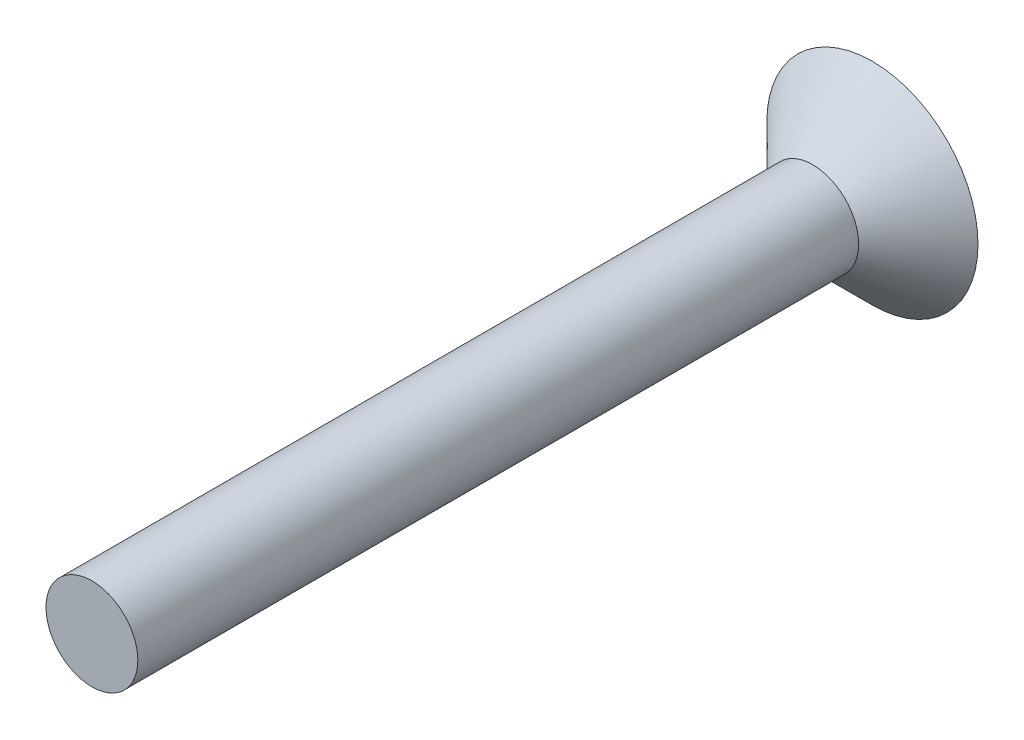
ISO-10303-21;
HEADER;
FILE_DESCRIPTION(('STEP AP214'),'2;1');
FILE_NAME('part.step','',(''),(''),'','','');
FILE_SCHEMA(('AUTOMOTIVE_DESIGN { 1 0 10303 214 1 1 1 1 }'));
ENDSEC;
DATA;
#1=APPLICATION_CONTEXT('core data for automotive mechanical design processes');
#2=APPLICATION_PROTOCOL_DEFINITION('international standard','automotive_design',2000,#1);
#3=PRODUCT_CONTEXT('',#1,'mechanical');
#4=PRODUCT('Part','Part','',(#3));
#5=PRODUCT_RELATED_PRODUCT_CATEGORY('part','',(#4));
#6=PRODUCT_DEFINITION_FORMATION('','',#4);
#7=PRODUCT_DEFINITION_CONTEXT('part definition',#1,'design');
#8=PRODUCT_DEFINITION('design','',#6,#7);
#9=PRODUCT_DEFINITION_SHAPE('','',#8);
#10=(LENGTH_UNIT() NAMED_UNIT(*) SI_UNIT(.MILLI.,.METRE.));
#11=(NAMED_UNIT(*) PLANE_ANGLE_UNIT() SI_UNIT($,.RADIAN.));
#12=(NAMED_UNIT(*) SI_UNIT($,.STERADIAN.) SOLID_ANGLE_UNIT());
#13=UNCERTAINTY_MEASURE_WITH_UNIT(LENGTH_MEASURE(1.E-05),#10,'distance_accuracy_value','');
#14=(GEOMETRIC_REPRESENTATION_CONTEXT(3) GLOBAL_UNCERTAINTY_ASSIGNED_CONTEXT((#13)) GLOBAL_UNIT_ASSIGNED_CONTEXT((#10,
#11,#12)) REPRESENTATION_CONTEXT('',''));
#15=CARTESIAN_POINT('',(0.,0.,0.));
#16=DIRECTION('',(0.,0.,1.));
#17=DIRECTION('',(1.,0.,0.));
#18=AXIS2_PLACEMENT_3D('',#15,#16,#17);
#19=CARTESIAN_POINT('',(0.,0.,34.));
#20=DIRECTION('',(0.,0.,-1.));
#21=DIRECTION('',(-1.,0.,0.));
#22=AXIS2_PLACEMENT_3D('',#19,#20,#21);
#23=CYLINDRICAL_SURFACE('',#22,2.);
#24=CARTESIAN_POINT('',(0.,0.,34.));
#25=DIRECTION('',(0.,0.,1.));
#26=DIRECTION('',(1.,0.,0.));
#27=AXIS2_PLACEMENT_3D('',#24,#25,#26);
#28=CIRCLE('',#27,2.);
#29=CARTESIAN_POINT('',(2.,0.,34.));
#30=VERTEX_POINT('',#29);
#31=EDGE_CURVE('E46',#30,#30,#28,.T.);
#32=ORIENTED_EDGE('',*,*,#31,.F.);
#33=EDGE_LOOP('',(#32));
#34=FACE_BOUND('',#33,.T.);
#35=CARTESIAN_POINT('',(0.,0.,2.6));
#36=DIRECTION('',(0.,0.,-1.));
#37=DIRECTION('',(-1.,0.,0.));
#38=AXIS2_PLACEMENT_3D('',#35,#36,#37);
#39=CIRCLE('',#38,2.);
#40=CARTESIAN_POINT('',(-2.,0.,2.6));
#41=VERTEX_POINT('',#40);
#42=EDGE_CURVE('E11',#41,#41,#39,.T.);
#43=ORIENTED_EDGE('',*,*,#42,.F.);
#44=EDGE_LOOP('',(#43));
#45=FACE_BOUND('',#44,.T.);
#46=ADVANCED_FACE('F38',(#34,#45),#23,.T.);
#47=CARTESIAN_POINT('',(0.,0.,34.));
#48=DIRECTION('',(0.,0.,1.));
#49=DIRECTION('',(1.,0.,0.));
#50=AXIS2_PLACEMENT_3D('',#47,#48,#49);
#51=PLANE('',#50);
#52=ORIENTED_EDGE('',*,*,#31,.T.);
#53=EDGE_LOOP('',(#52));
#54=FACE_BOUND('',#53,.T.);
#55=ADVANCED_FACE('F168',(#54),#51,.T.);
#56=CARTESIAN_POINT('',(0.,0.,2.6));
#57=DIRECTION('',(0.,0.,-1.));
#58=DIRECTION('',(-1.,0.,0.));
#59=AXIS2_PLACEMENT_3D('',#56,#57,#58);
#60=CONICAL_SURFACE('',#59,2.,0.785398163397448);
#61=CARTESIAN_POINT('',(0.,0.,0.));
#62=DIRECTION('',(0.,0.,-1.));
#63=DIRECTION('',(-1.,0.,0.));
#64=AXIS2_PLACEMENT_3D('',#61,#62,#63);
#65=CIRCLE('',#64,4.6);
#66=CARTESIAN_POINT('',(-4.6,0.,0.));
#67=VERTEX_POINT('',#66);
#68=EDGE_CURVE('E152',#67,#67,#65,.T.);
#69=ORIENTED_EDGE('',*,*,#68,.F.);
#70=EDGE_LOOP('',(#69));
#71=FACE_BOUND('',#70,.T.);
#72=ORIENTED_EDGE('',*,*,#42,.T.);
#73=EDGE_LOOP('',(#72));
#74=FACE_BOUND('',#73,.T.);
#75=ADVANCED_FACE('F174',(#71,#74),#60,.T.);
#76=CARTESIAN_POINT('',(0.,0.,0.));
#77=DIRECTION('',(0.,0.,1.));
#78=DIRECTION('',(1.,0.,0.));
#79=AXIS2_PLACEMENT_3D('',#76,#77,#78);
#80=PLANE('',#79);
#81=DIRECTION('',(0.593026118257889,-0.805183223287706,0.));
#82=VECTOR('',#81,1.);
#83=CARTESIAN_POINT('',(0.597011270214796,1.36468954097132,0.));
#84=LINE('',#83,#82);
#85=CARTESIAN_POINT('',(0.597011270214796,1.36468954097132,0.));
#86=VERTEX_POINT('',#85);
#87=CARTESIAN_POINT('',(1.48036144586749,0.165317844134031,0.));
#88=VERTEX_POINT('',#87);
#89=EDGE_CURVE('E133',#86,#88,#84,.T.);
#90=ORIENTED_EDGE('',*,*,#89,.F.);
#91=DIRECTION('',(0.993822185197136,0.110984071875153,0.));
#92=VECTOR('',#91,1.);
#93=CARTESIAN_POINT('',(-0.883350175652691,1.19937169683729,0.));
#94=LINE('',#93,#92);
#95=CARTESIAN_POINT('',(-0.883350175652691,1.19937169683729,0.));
#96=VERTEX_POINT('',#95);
#97=EDGE_CURVE('E53',#96,#86,#94,.T.);
#98=ORIENTED_EDGE('',*,*,#97,.F.);
#99=DIRECTION('',(0.400796066939247,0.91616729516286,0.));
#100=VECTOR('',#99,1.);
#101=CARTESIAN_POINT('',(-1.48036144586749,-0.165317844134032,0.));
#102=LINE('',#101,#100);
#103=CARTESIAN_POINT('',(-1.48036144586749,-0.165317844134032,0.));
#104=VERTEX_POINT('',#103);
#105=EDGE_CURVE('E146',#104,#96,#102,.T.);
#106=ORIENTED_EDGE('',*,*,#105,.F.);
#107=DIRECTION('',(-0.593026118257889,0.805183223287706,0.));
#108=VECTOR('',#107,1.);
#109=CARTESIAN_POINT('',(-0.597011270214795,-1.36468954097132,0.));
#110=LINE('',#109,#108);
#111=CARTESIAN_POINT('',(-0.597011270214795,-1.36468954097132,0.));
#112=VERTEX_POINT('',#111);
#113=EDGE_CURVE('E143',#112,#104,#110,.T.);
#114=ORIENTED_EDGE('',*,*,#113,.F.);
#115=DIRECTION('',(-0.993822185197136,-0.110984071875153,0.));
#116=VECTOR('',#115,1.);
#117=CARTESIAN_POINT('',(0.883350175652692,-1.19937169683729,0.));
#118=LINE('',#117,#116);
#119=CARTESIAN_POINT('',(0.883350175652692,-1.19937169683729,0.));
#120=VERTEX_POINT('',#119);
#121=EDGE_CURVE('E101',#120,#112,#118,.T.);
#122=ORIENTED_EDGE('',*,*,#121,.F.);
#123=DIRECTION('',(-0.400796066939247,-0.91616729516286,0.));
#124=VECTOR('',#123,1.);
#125=CARTESIAN_POINT('',(1.48036144586749,0.165317844134031,0.));
#126=LINE('',#125,#124);
#127=EDGE_CURVE('E137',#88,#120,#126,.T.);
#128=ORIENTED_EDGE('',*,*,#127,.F.);
#129=EDGE_LOOP('',(#90,#98,#106,#114,#122,#128));
#130=FACE_BOUND('',#129,.T.);
#131=ORIENTED_EDGE('',*,*,#68,.T.);
#132=EDGE_LOOP('',(#131));
#133=FACE_BOUND('',#132,.T.);
#134=ADVANCED_FACE('F176',(#130,#133),#80,.F.);
#135=CARTESIAN_POINT('',(-0.883350175652691,1.19937169683729,1.8));
#136=DIRECTION('',(-0.110984071875153,0.993822185197136,0.));
#137=DIRECTION('',(-0.993822185197136,-0.110984071875153,0.));
#138=AXIS2_PLACEMENT_3D('',#135,#136,#137);
#139=PLANE('',#138);
#140=ORIENTED_EDGE('',*,*,#97,.T.);
#141=DIRECTION('',(0.,0.,-1.));
#142=VECTOR('',#141,1.);
#143=CARTESIAN_POINT('',(0.597011270214796,1.36468954097132,1.8));
#144=LINE('',#143,#142);
#145=CARTESIAN_POINT('',(0.597011270214796,1.36468954097132,1.8));
#146=VERTEX_POINT('',#145);
#147=EDGE_CURVE('E83',#146,#86,#144,.T.);
#148=ORIENTED_EDGE('',*,*,#147,.F.);
#149=DIRECTION('',(0.993822185197136,0.110984071875153,0.));
#150=VECTOR('',#149,1.);
#151=CARTESIAN_POINT('',(-0.883350175652691,1.19937169683729,1.8));
#152=LINE('',#151,#150);
#153=CARTESIAN_POINT('',(-0.883350175652691,1.19937169683729,1.8));
#154=VERTEX_POINT('',#153);
#155=EDGE_CURVE('E149',#154,#146,#152,.T.);
#156=ORIENTED_EDGE('',*,*,#155,.F.);
#157=DIRECTION('',(0.,0.,-1.));
#158=VECTOR('',#157,1.);
#159=CARTESIAN_POINT('',(-0.883350175652691,1.19937169683729,1.8));
#160=LINE('',#159,#158);
#161=EDGE_CURVE('E61',#154,#96,#160,.T.);
#162=ORIENTED_EDGE('',*,*,#161,.T.);
#163=EDGE_LOOP('',(#140,#148,#156,#162));
#164=FACE_BOUND('',#163,.T.);
#165=ADVANCED_FACE('F184',(#164),#139,.F.);
#166=CARTESIAN_POINT('',(-1.48036144586749,-0.165317844134032,1.8));
#167=DIRECTION('',(-0.91616729516286,0.400796066939247,0.));
#168=DIRECTION('',(-0.400796066939247,-0.91616729516286,0.));
#169=AXIS2_PLACEMENT_3D('',#166,#167,#168);
#170=PLANE('',#169);
#171=ORIENTED_EDGE('',*,*,#105,.T.);
#172=ORIENTED_EDGE('',*,*,#161,.F.);
#173=DIRECTION('',(0.400796066939247,0.91616729516286,0.));
#174=VECTOR('',#173,1.);
#175=CARTESIAN_POINT('',(-1.48036144586749,-0.165317844134032,1.8));
#176=LINE('',#175,#174);
#177=CARTESIAN_POINT('',(-1.48036144586749,-0.165317844134032,1.8));
#178=VERTEX_POINT('',#177);
#179=EDGE_CURVE('E115',#178,#154,#176,.T.);
#180=ORIENTED_EDGE('',*,*,#179,.F.);
#181=DIRECTION('',(0.,0.,-1.));
#182=VECTOR('',#181,1.);
#183=CARTESIAN_POINT('',(-1.48036144586749,-0.165317844134032,1.8));
#184=LINE('',#183,#182);
#185=EDGE_CURVE('E106',#178,#104,#184,.T.);
#186=ORIENTED_EDGE('',*,*,#185,.T.);
#187=EDGE_LOOP('',(#171,#172,#180,#186));
#188=FACE_BOUND('',#187,.T.);
#189=ADVANCED_FACE('F191',(#188),#170,.F.);
#190=CARTESIAN_POINT('',(-0.597011270214795,-1.36468954097132,1.8));
#191=DIRECTION('',(-0.805183223287706,-0.593026118257889,0.));
#192=DIRECTION('',(0.593026118257889,-0.805183223287706,0.));
#193=AXIS2_PLACEMENT_3D('',#190,#191,#192);
#194=PLANE('',#193);
#195=ORIENTED_EDGE('',*,*,#113,.T.);
#196=ORIENTED_EDGE('',*,*,#185,.F.);
#197=DIRECTION('',(-0.593026118257889,0.805183223287706,0.));
#198=VECTOR('',#197,1.);
#199=CARTESIAN_POINT('',(-0.597011270214795,-1.36468954097132,1.8));
#200=LINE('',#199,#198);
#201=CARTESIAN_POINT('',(-0.597011270214795,-1.36468954097132,1.8));
#202=VERTEX_POINT('',#201);
#203=EDGE_CURVE('E110',#202,#178,#200,.T.);
#204=ORIENTED_EDGE('',*,*,#203,.F.);
#205=DIRECTION('',(0.,0.,-1.));
#206=VECTOR('',#205,1.);
#207=CARTESIAN_POINT('',(-0.597011270214795,-1.36468954097132,1.8));
#208=LINE('',#207,#206);
#209=EDGE_CURVE('E94',#202,#112,#208,.T.);
#210=ORIENTED_EDGE('',*,*,#209,.T.);
#211=EDGE_LOOP('',(#195,#196,#204,#210));
#212=FACE_BOUND('',#211,.T.);
#213=ADVANCED_FACE('F111',(#212),#194,.F.);
#214=CARTESIAN_POINT('',(0.883350175652692,-1.19937169683729,1.8));
#215=DIRECTION('',(0.110984071875154,-0.993822185197136,0.));
#216=DIRECTION('',(0.993822185197136,0.110984071875154,0.));
#217=AXIS2_PLACEMENT_3D('',#214,#215,#216);
#218=PLANE('',#217);
#219=ORIENTED_EDGE('',*,*,#121,.T.);
#220=ORIENTED_EDGE('',*,*,#209,.F.);
#221=DIRECTION('',(-0.993822185197136,-0.110984071875153,0.));
#222=VECTOR('',#221,1.);
#223=CARTESIAN_POINT('',(0.883350175652692,-1.19937169683729,1.8));
#224=LINE('',#223,#222);
#225=CARTESIAN_POINT('',(0.883350175652692,-1.19937169683729,1.8));
#226=VERTEX_POINT('',#225);
#227=EDGE_CURVE('E98',#226,#202,#224,.T.);
#228=ORIENTED_EDGE('',*,*,#227,.F.);
#229=DIRECTION('',(0.,0.,-1.));
#230=VECTOR('',#229,1.);
#231=CARTESIAN_POINT('',(0.883350175652692,-1.19937169683729,1.8));
#232=LINE('',#231,#230);
#233=EDGE_CURVE('E107',#226,#120,#232,.T.);
#234=ORIENTED_EDGE('',*,*,#233,.T.);
#235=EDGE_LOOP('',(#219,#220,#228,#234));
#236=FACE_BOUND('',#235,.T.);
#237=ADVANCED_FACE('F96',(#236),#218,.F.);
#238=CARTESIAN_POINT('',(1.48036144586749,0.165317844134031,1.8));
#239=DIRECTION('',(0.91616729516286,-0.400796066939247,0.));
#240=DIRECTION('',(0.400796066939247,0.91616729516286,0.));
#241=AXIS2_PLACEMENT_3D('',#238,#239,#240);
#242=PLANE('',#241);
#243=ORIENTED_EDGE('',*,*,#127,.T.);
#244=ORIENTED_EDGE('',*,*,#233,.F.);
#245=DIRECTION('',(-0.400796066939247,-0.91616729516286,0.));
#246=VECTOR('',#245,1.);
#247=CARTESIAN_POINT('',(1.48036144586749,0.165317844134031,1.8));
#248=LINE('',#247,#246);
#249=CARTESIAN_POINT('',(1.48036144586749,0.165317844134031,1.8));
#250=VERTEX_POINT('',#249);
#251=EDGE_CURVE('E121',#250,#226,#248,.T.);
#252=ORIENTED_EDGE('',*,*,#251,.F.);
#253=DIRECTION('',(0.,0.,-1.));
#254=VECTOR('',#253,1.);
#255=CARTESIAN_POINT('',(1.48036144586749,0.165317844134031,1.8));
#256=LINE('',#255,#254);
#257=EDGE_CURVE('E157',#250,#88,#256,.T.);
#258=ORIENTED_EDGE('',*,*,#257,.T.);
#259=EDGE_LOOP('',(#243,#244,#252,#258));
#260=FACE_BOUND('',#259,.T.);
#261=ADVANCED_FACE('F195',(#260),#242,.F.);
#262=CARTESIAN_POINT('',(0.597011270214796,1.36468954097132,1.8));
#263=DIRECTION('',(0.805183223287706,0.593026118257889,0.));
#264=DIRECTION('',(-0.593026118257889,0.805183223287706,0.));
#265=AXIS2_PLACEMENT_3D('',#262,#263,#264);
#266=PLANE('',#265);
#267=ORIENTED_EDGE('',*,*,#89,.T.);
#268=ORIENTED_EDGE('',*,*,#257,.F.);
#269=DIRECTION('',(0.593026118257889,-0.805183223287706,0.));
#270=VECTOR('',#269,1.);
#271=CARTESIAN_POINT('',(0.597011270214796,1.36468954097132,1.8));
#272=LINE('',#271,#270);
#273=EDGE_CURVE('E125',#146,#250,#272,.T.);
#274=ORIENTED_EDGE('',*,*,#273,.F.);
#275=ORIENTED_EDGE('',*,*,#147,.T.);
#276=EDGE_LOOP('',(#267,#268,#274,#275));
#277=FACE_BOUND('',#276,.T.);
#278=ADVANCED_FACE('F192',(#277),#266,.F.);
#279=CARTESIAN_POINT('',(0.,0.,1.8));
#280=DIRECTION('',(0.,0.,-1.));
#281=DIRECTION('',(-1.,0.,0.));
#282=AXIS2_PLACEMENT_3D('',#279,#280,#281);
#283=PLANE('',#282);
#284=ORIENTED_EDGE('',*,*,#155,.T.);
#285=ORIENTED_EDGE('',*,*,#273,.T.);
#286=ORIENTED_EDGE('',*,*,#251,.T.);
#287=ORIENTED_EDGE('',*,*,#227,.T.);
#288=ORIENTED_EDGE('',*,*,#203,.T.);
#289=ORIENTED_EDGE('',*,*,#179,.T.);
#290=EDGE_LOOP('',(#284,#285,#286,#287,#288,#289));
#291=FACE_BOUND('',#290,.T.);
#292=ADVANCED_FACE('F118',(#291),#283,.T.);
#293=CLOSED_SHELL('',(#46,#55,#75,#134,#165,#189,#213,#237,#261,#278,#292));
#294=MANIFOLD_SOLID_BREP('B2',#293);
#295=ADVANCED_BREP_SHAPE_REPRESENTATION('',(#18,#294),#14);
#296=SHAPE_DEFINITION_REPRESENTATION(#9,#295);
ENDSEC;
END-ISO-10303-21;
